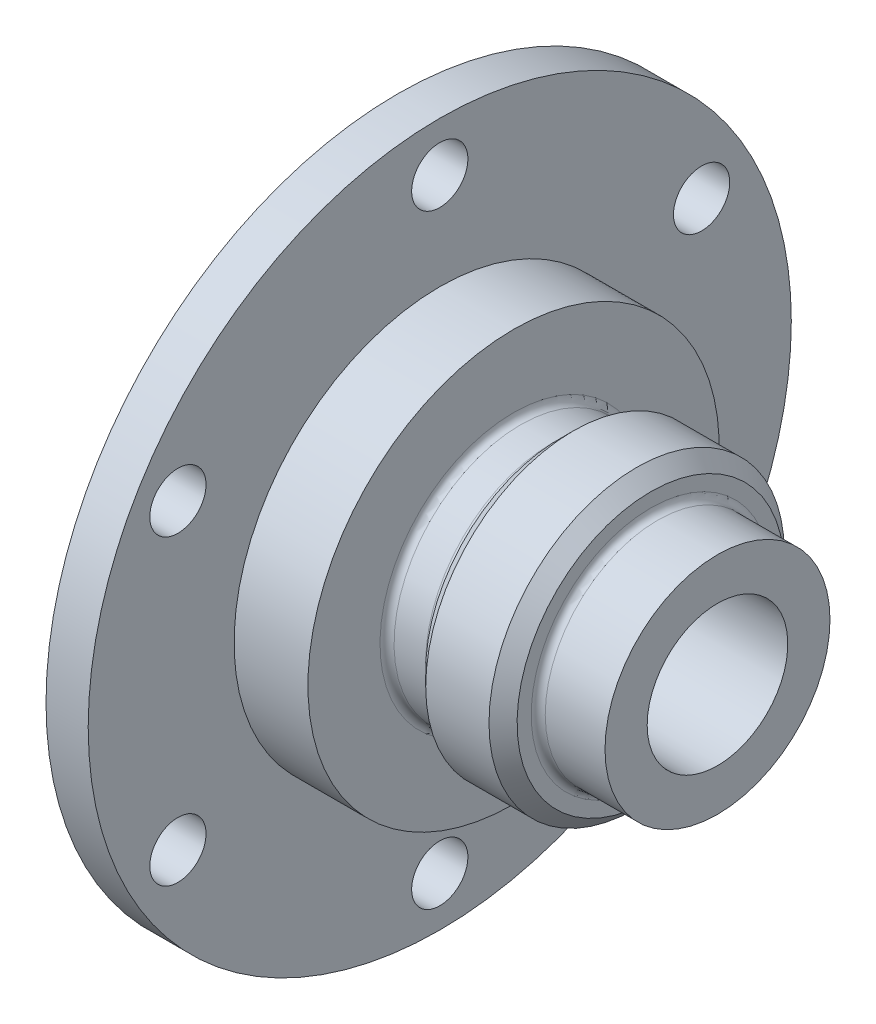
ISO-10303-21;
HEADER;
FILE_DESCRIPTION(('STEP AP214'),'2;1');
FILE_NAME('part.step','',(''),(''),'','','');
FILE_SCHEMA(('AUTOMOTIVE_DESIGN { 1 0 10303 214 1 1 1 1 }'));
ENDSEC;
DATA;
#1=APPLICATION_CONTEXT('core data for automotive mechanical design processes');
#2=APPLICATION_PROTOCOL_DEFINITION('international standard','automotive_design',2000,#1);
#3=PRODUCT_CONTEXT('',#1,'mechanical');
#4=PRODUCT('Part','Part','',(#3));
#5=PRODUCT_RELATED_PRODUCT_CATEGORY('part','',(#4));
#6=PRODUCT_DEFINITION_FORMATION('','',#4);
#7=PRODUCT_DEFINITION_CONTEXT('part definition',#1,'design');
#8=PRODUCT_DEFINITION('design','',#6,#7);
#9=PRODUCT_DEFINITION_SHAPE('','',#8);
#10=(LENGTH_UNIT() NAMED_UNIT(*) SI_UNIT(.MILLI.,.METRE.));
#11=(NAMED_UNIT(*) PLANE_ANGLE_UNIT() SI_UNIT($,.RADIAN.));
#12=(NAMED_UNIT(*) SI_UNIT($,.STERADIAN.) SOLID_ANGLE_UNIT());
#13=UNCERTAINTY_MEASURE_WITH_UNIT(LENGTH_MEASURE(1.E-05),#10,'distance_accuracy_value','');
#14=(GEOMETRIC_REPRESENTATION_CONTEXT(3) GLOBAL_UNCERTAINTY_ASSIGNED_CONTEXT((#13)) GLOBAL_UNIT_ASSIGNED_CONTEXT((#10,
#11,#12)) REPRESENTATION_CONTEXT('',''));
#15=CARTESIAN_POINT('',(0.,0.,0.));
#16=DIRECTION('',(0.,0.,1.));
#17=DIRECTION('',(1.,0.,0.));
#18=AXIS2_PLACEMENT_3D('',#15,#16,#17);
#19=CARTESIAN_POINT('',(0.,0.,0.));
#20=DIRECTION('',(-1.,0.,0.));
#21=DIRECTION('',(0.,-1.,0.));
#22=AXIS2_PLACEMENT_3D('',#19,#20,#21);
#23=PLANE('',#22);
#24=CARTESIAN_POINT('',(0.,43.,0.));
#25=DIRECTION('',(-1.,0.,0.));
#26=DIRECTION('',(0.,0.,1.));
#27=AXIS2_PLACEMENT_3D('',#24,#25,#26);
#28=CIRCLE('',#27,4.00000000000002);
#29=CARTESIAN_POINT('',(0.,43.,4.00000000000002));
#30=VERTEX_POINT('',#29);
#31=EDGE_CURVE('E83',#30,#30,#28,.T.);
#32=ORIENTED_EDGE('',*,*,#31,.F.);
#33=EDGE_LOOP('',(#32));
#34=FACE_BOUND('',#33,.T.);
#35=CARTESIAN_POINT('',(0.,21.4999999999999,37.2390923627309));
#36=DIRECTION('',(-1.,0.,0.));
#37=DIRECTION('',(0.,0.,1.));
#38=AXIS2_PLACEMENT_3D('',#35,#36,#37);
#39=CIRCLE('',#38,4.00000000000001);
#40=CARTESIAN_POINT('',(0.,21.4999999999999,41.2390923627309));
#41=VERTEX_POINT('',#40);
#42=EDGE_CURVE('E82',#41,#41,#39,.T.);
#43=ORIENTED_EDGE('',*,*,#42,.F.);
#44=EDGE_LOOP('',(#43));
#45=FACE_BOUND('',#44,.T.);
#46=CARTESIAN_POINT('',(0.,-21.5000000000002,37.2390923627308));
#47=DIRECTION('',(-1.,0.,0.));
#48=DIRECTION('',(0.,0.,1.));
#49=AXIS2_PLACEMENT_3D('',#46,#47,#48);
#50=CIRCLE('',#49,4.00000000000001);
#51=CARTESIAN_POINT('',(0.,-21.5000000000002,41.2390923627308));
#52=VERTEX_POINT('',#51);
#53=EDGE_CURVE('E88',#52,#52,#50,.T.);
#54=ORIENTED_EDGE('',*,*,#53,.F.);
#55=EDGE_LOOP('',(#54));
#56=FACE_BOUND('',#55,.T.);
#57=CARTESIAN_POINT('',(0.,-43.,-3.00267395140509E-13));
#58=DIRECTION('',(-1.,0.,0.));
#59=DIRECTION('',(0.,0.,1.));
#60=AXIS2_PLACEMENT_3D('',#57,#58,#59);
#61=CIRCLE('',#60,4.00000000000002);
#62=CARTESIAN_POINT('',(0.,-43.,3.99999999999972));
#63=VERTEX_POINT('',#62);
#64=EDGE_CURVE('E87',#63,#63,#61,.T.);
#65=ORIENTED_EDGE('',*,*,#64,.F.);
#66=EDGE_LOOP('',(#65));
#67=FACE_BOUND('',#66,.T.);
#68=CARTESIAN_POINT('',(0.,-21.4999999999997,-37.2390923627311));
#69=DIRECTION('',(-1.,0.,0.));
#70=DIRECTION('',(0.,0.,1.));
#71=AXIS2_PLACEMENT_3D('',#68,#69,#70);
#72=CIRCLE('',#71,4.00000000000001);
#73=CARTESIAN_POINT('',(0.,-21.4999999999997,-33.239092362731));
#74=VERTEX_POINT('',#73);
#75=EDGE_CURVE('E92',#74,#74,#72,.T.);
#76=ORIENTED_EDGE('',*,*,#75,.F.);
#77=EDGE_LOOP('',(#76));
#78=FACE_BOUND('',#77,.T.);
#79=CARTESIAN_POINT('',(0.,21.5000000000004,-37.2390923627306));
#80=DIRECTION('',(-1.,0.,0.));
#81=DIRECTION('',(0.,0.,1.));
#82=AXIS2_PLACEMENT_3D('',#79,#80,#81);
#83=CIRCLE('',#82,4.00000000000001);
#84=CARTESIAN_POINT('',(0.,21.5000000000004,-33.2390923627306));
#85=VERTEX_POINT('',#84);
#86=EDGE_CURVE('E96',#85,#85,#83,.T.);
#87=ORIENTED_EDGE('',*,*,#86,.F.);
#88=EDGE_LOOP('',(#87));
#89=FACE_BOUND('',#88,.T.);
#90=CARTESIAN_POINT('',(0.,0.,0.));
#91=DIRECTION('',(-1.,0.,0.));
#92=DIRECTION('',(0.,0.,1.));
#93=AXIS2_PLACEMENT_3D('',#90,#91,#92);
#94=CIRCLE('',#93,22.25);
#95=CARTESIAN_POINT('',(0.,0.,22.25));
#96=VERTEX_POINT('',#95);
#97=EDGE_CURVE('E100',#96,#96,#94,.T.);
#98=ORIENTED_EDGE('',*,*,#97,.F.);
#99=EDGE_LOOP('',(#98));
#100=FACE_BOUND('',#99,.T.);
#101=CARTESIAN_POINT('',(0.,0.,0.));
#102=DIRECTION('',(1.,0.,0.));
#103=DIRECTION('',(0.,1.,0.));
#104=AXIS2_PLACEMENT_3D('',#101,#102,#103);
#105=CIRCLE('',#104,50.);
#106=CARTESIAN_POINT('',(0.,50.,0.));
#107=VERTEX_POINT('',#106);
#108=EDGE_CURVE('E78',#107,#107,#105,.T.);
#109=ORIENTED_EDGE('',*,*,#108,.F.);
#110=EDGE_LOOP('',(#109));
#111=FACE_BOUND('',#110,.T.);
#112=ADVANCED_FACE('F43',(#34,#45,#56,#67,#78,#89,#100,#111),#23,.T.);
#113=CARTESIAN_POINT('',(45.5,0.,0.));
#114=DIRECTION('',(1.,0.,0.));
#115=DIRECTION('',(0.,1.,0.));
#116=AXIS2_PLACEMENT_3D('',#113,#114,#115);
#117=CYLINDRICAL_SURFACE('',#116,50.);
#118=ORIENTED_EDGE('',*,*,#108,.T.);
#119=EDGE_LOOP('',(#118));
#120=FACE_BOUND('',#119,.T.);
#121=CARTESIAN_POINT('',(6.,0.,0.));
#122=DIRECTION('',(1.,0.,0.));
#123=DIRECTION('',(0.,1.,0.));
#124=AXIS2_PLACEMENT_3D('',#121,#122,#123);
#125=CIRCLE('',#124,50.);
#126=CARTESIAN_POINT('',(6.,50.,0.));
#127=VERTEX_POINT('',#126);
#128=EDGE_CURVE('E103',#127,#127,#125,.T.);
#129=ORIENTED_EDGE('',*,*,#128,.F.);
#130=EDGE_LOOP('',(#129));
#131=FACE_BOUND('',#130,.T.);
#132=ADVANCED_FACE('F146',(#120,#131),#117,.T.);
#133=CARTESIAN_POINT('',(6.,50.,0.));
#134=DIRECTION('',(1.,0.,0.));
#135=DIRECTION('',(0.,1.,0.));
#136=AXIS2_PLACEMENT_3D('',#133,#134,#135);
#137=PLANE('',#136);
#138=CARTESIAN_POINT('',(6.,43.,0.));
#139=DIRECTION('',(1.,0.,0.));
#140=DIRECTION('',(0.,1.,0.));
#141=AXIS2_PLACEMENT_3D('',#138,#139,#140);
#142=CIRCLE('',#141,4.00000000000001);
#143=CARTESIAN_POINT('',(6.,47.,0.));
#144=VERTEX_POINT('',#143);
#145=EDGE_CURVE('E79',#144,#144,#142,.T.);
#146=ORIENTED_EDGE('',*,*,#145,.F.);
#147=EDGE_LOOP('',(#146));
#148=FACE_BOUND('',#147,.T.);
#149=CARTESIAN_POINT('',(6.,21.4999999999999,37.2390923627309));
#150=DIRECTION('',(1.,0.,0.));
#151=DIRECTION('',(0.,1.,0.));
#152=AXIS2_PLACEMENT_3D('',#149,#150,#151);
#153=CIRCLE('',#152,4.00000000000001);
#154=CARTESIAN_POINT('',(6.,25.4999999999999,37.2390923627309));
#155=VERTEX_POINT('',#154);
#156=EDGE_CURVE('E134',#155,#155,#153,.T.);
#157=ORIENTED_EDGE('',*,*,#156,.F.);
#158=EDGE_LOOP('',(#157));
#159=FACE_BOUND('',#158,.T.);
#160=CARTESIAN_POINT('',(6.,-21.5000000000002,37.2390923627308));
#161=DIRECTION('',(1.,0.,0.));
#162=DIRECTION('',(0.,1.,0.));
#163=AXIS2_PLACEMENT_3D('',#160,#161,#162);
#164=CIRCLE('',#163,4.00000000000001);
#165=CARTESIAN_POINT('',(6.,-17.5000000000002,37.2390923627308));
#166=VERTEX_POINT('',#165);
#167=EDGE_CURVE('E84',#166,#166,#164,.T.);
#168=ORIENTED_EDGE('',*,*,#167,.F.);
#169=EDGE_LOOP('',(#168));
#170=FACE_BOUND('',#169,.T.);
#171=CARTESIAN_POINT('',(6.,-43.,-3.00267395140509E-13));
#172=DIRECTION('',(1.,0.,0.));
#173=DIRECTION('',(0.,1.,0.));
#174=AXIS2_PLACEMENT_3D('',#171,#172,#173);
#175=CIRCLE('',#174,4.00000000000001);
#176=CARTESIAN_POINT('',(6.,-39.,-3.00267395140509E-13));
#177=VERTEX_POINT('',#176);
#178=EDGE_CURVE('E89',#177,#177,#175,.T.);
#179=ORIENTED_EDGE('',*,*,#178,.F.);
#180=EDGE_LOOP('',(#179));
#181=FACE_BOUND('',#180,.T.);
#182=CARTESIAN_POINT('',(6.,-21.4999999999997,-37.2390923627311));
#183=DIRECTION('',(1.,0.,0.));
#184=DIRECTION('',(0.,1.,0.));
#185=AXIS2_PLACEMENT_3D('',#182,#183,#184);
#186=CIRCLE('',#185,4.00000000000001);
#187=CARTESIAN_POINT('',(6.,-17.4999999999996,-37.2390923627311));
#188=VERTEX_POINT('',#187);
#189=EDGE_CURVE('E93',#188,#188,#186,.T.);
#190=ORIENTED_EDGE('',*,*,#189,.F.);
#191=EDGE_LOOP('',(#190));
#192=FACE_BOUND('',#191,.T.);
#193=CARTESIAN_POINT('',(6.,21.5000000000004,-37.2390923627306));
#194=DIRECTION('',(1.,0.,0.));
#195=DIRECTION('',(0.,1.,0.));
#196=AXIS2_PLACEMENT_3D('',#193,#194,#195);
#197=CIRCLE('',#196,4.00000000000001);
#198=CARTESIAN_POINT('',(6.,25.5000000000004,-37.2390923627306));
#199=VERTEX_POINT('',#198);
#200=EDGE_CURVE('E97',#199,#199,#197,.T.);
#201=ORIENTED_EDGE('',*,*,#200,.F.);
#202=EDGE_LOOP('',(#201));
#203=FACE_BOUND('',#202,.T.);
#204=ORIENTED_EDGE('',*,*,#128,.T.);
#205=EDGE_LOOP('',(#204));
#206=FACE_BOUND('',#205,.T.);
#207=CARTESIAN_POINT('',(6.00000000000001,0.,0.));
#208=DIRECTION('',(1.,0.,0.));
#209=DIRECTION('',(0.,1.,0.));
#210=AXIS2_PLACEMENT_3D('',#207,#208,#209);
#211=CIRCLE('',#210,29.25);
#212=CARTESIAN_POINT('',(6.00000000000001,29.25,0.));
#213=VERTEX_POINT('',#212);
#214=EDGE_CURVE('E106',#213,#213,#211,.T.);
#215=ORIENTED_EDGE('',*,*,#214,.F.);
#216=EDGE_LOOP('',(#215));
#217=FACE_BOUND('',#216,.T.);
#218=ADVANCED_FACE('F164',(#148,#159,#170,#181,#192,#203,#206,#217),#137,.T.);
#219=CARTESIAN_POINT('',(45.5,0.,0.));
#220=DIRECTION('',(1.,0.,0.));
#221=DIRECTION('',(0.,1.,0.));
#222=AXIS2_PLACEMENT_3D('',#219,#220,#221);
#223=CYLINDRICAL_SURFACE('',#222,29.25);
#224=ORIENTED_EDGE('',*,*,#214,.T.);
#225=EDGE_LOOP('',(#224));
#226=FACE_BOUND('',#225,.T.);
#227=CARTESIAN_POINT('',(16.5,0.,0.));
#228=DIRECTION('',(1.,0.,0.));
#229=DIRECTION('',(0.,1.,0.));
#230=AXIS2_PLACEMENT_3D('',#227,#228,#229);
#231=CIRCLE('',#230,29.25);
#232=CARTESIAN_POINT('',(16.5,29.25,0.));
#233=VERTEX_POINT('',#232);
#234=EDGE_CURVE('E109',#233,#233,#231,.T.);
#235=ORIENTED_EDGE('',*,*,#234,.F.);
#236=EDGE_LOOP('',(#235));
#237=FACE_BOUND('',#236,.T.);
#238=ADVANCED_FACE('F170',(#226,#237),#223,.T.);
#239=CARTESIAN_POINT('',(16.5,29.25,0.));
#240=DIRECTION('',(1.,0.,0.));
#241=DIRECTION('',(0.,1.,0.));
#242=AXIS2_PLACEMENT_3D('',#239,#240,#241);
#243=PLANE('',#242);
#244=CARTESIAN_POINT('',(16.5,0.,0.));
#245=DIRECTION('',(1.,0.,0.));
#246=DIRECTION('',(0.,1.,0.));
#247=AXIS2_PLACEMENT_3D('',#244,#245,#246);
#248=CIRCLE('',#247,19.);
#249=CARTESIAN_POINT('',(16.5,19.,0.));
#250=VERTEX_POINT('',#249);
#251=EDGE_CURVE('E10',#250,#250,#248,.F.);
#252=ORIENTED_EDGE('',*,*,#251,.T.);
#253=EDGE_LOOP('',(#252));
#254=FACE_BOUND('',#253,.T.);
#255=ORIENTED_EDGE('',*,*,#234,.T.);
#256=EDGE_LOOP('',(#255));
#257=FACE_BOUND('',#256,.T.);
#258=ADVANCED_FACE('F177',(#254,#257),#243,.T.);
#259=CARTESIAN_POINT('',(45.5,0.,0.));
#260=DIRECTION('',(1.,0.,0.));
#261=DIRECTION('',(0.,1.,0.));
#262=AXIS2_PLACEMENT_3D('',#259,#260,#261);
#263=CYLINDRICAL_SURFACE('',#262,18.);
#264=CARTESIAN_POINT('',(22.,0.,0.));
#265=DIRECTION('',(-1.,0.,0.));
#266=DIRECTION('',(0.,-1.,0.));
#267=AXIS2_PLACEMENT_3D('',#264,#265,#266);
#268=CIRCLE('',#267,18.);
#269=CARTESIAN_POINT('',(22.,-18.,0.));
#270=VERTEX_POINT('',#269);
#271=EDGE_CURVE('E50',#270,#270,#268,.T.);
#272=ORIENTED_EDGE('',*,*,#271,.T.);
#273=EDGE_LOOP('',(#272));
#274=FACE_BOUND('',#273,.T.);
#275=CARTESIAN_POINT('',(17.5,0.,0.));
#276=DIRECTION('',(1.,0.,0.));
#277=DIRECTION('',(0.,1.,0.));
#278=AXIS2_PLACEMENT_3D('',#275,#276,#277);
#279=CIRCLE('',#278,18.);
#280=CARTESIAN_POINT('',(17.5,18.,0.));
#281=VERTEX_POINT('',#280);
#282=EDGE_CURVE('E54',#281,#281,#279,.T.);
#283=ORIENTED_EDGE('',*,*,#282,.T.);
#284=EDGE_LOOP('',(#283));
#285=FACE_BOUND('',#284,.T.);
#286=ADVANCED_FACE('F182',(#274,#285),#263,.T.);
#287=CARTESIAN_POINT('',(45.5,0.,0.));
#288=DIRECTION('',(1.,0.,0.));
#289=DIRECTION('',(0.,1.,0.));
#290=AXIS2_PLACEMENT_3D('',#287,#288,#289);
#291=CYLINDRICAL_SURFACE('',#290,21.);
#292=CARTESIAN_POINT('',(34.,0.,0.));
#293=DIRECTION('',(1.,0.,0.));
#294=DIRECTION('',(0.,1.,0.));
#295=AXIS2_PLACEMENT_3D('',#292,#293,#294);
#296=CIRCLE('',#295,21.);
#297=CARTESIAN_POINT('',(34.,21.,0.));
#298=VERTEX_POINT('',#297);
#299=EDGE_CURVE('E69',#298,#298,#296,.F.);
#300=ORIENTED_EDGE('',*,*,#299,.T.);
#301=EDGE_LOOP('',(#300));
#302=FACE_BOUND('',#301,.T.);
#303=CARTESIAN_POINT('',(25.,0.,0.));
#304=DIRECTION('',(-1.,0.,0.));
#305=DIRECTION('',(0.,-1.,0.));
#306=AXIS2_PLACEMENT_3D('',#303,#304,#305);
#307=CIRCLE('',#306,21.);
#308=CARTESIAN_POINT('',(25.,-21.,0.));
#309=VERTEX_POINT('',#308);
#310=EDGE_CURVE('E72',#309,#309,#307,.F.);
#311=ORIENTED_EDGE('',*,*,#310,.T.);
#312=EDGE_LOOP('',(#311));
#313=FACE_BOUND('',#312,.T.);
#314=ADVANCED_FACE('F188',(#302,#313),#291,.T.);
#315=CARTESIAN_POINT('',(36.,21.,0.));
#316=DIRECTION('',(1.,0.,0.));
#317=DIRECTION('',(0.,1.,0.));
#318=AXIS2_PLACEMENT_3D('',#315,#316,#317);
#319=PLANE('',#318);
#320=CARTESIAN_POINT('',(36.,0.,0.));
#321=DIRECTION('',(1.,0.,0.));
#322=DIRECTION('',(0.,1.,0.));
#323=AXIS2_PLACEMENT_3D('',#320,#321,#322);
#324=CIRCLE('',#323,17.);
#325=CARTESIAN_POINT('',(36.,17.,0.));
#326=VERTEX_POINT('',#325);
#327=EDGE_CURVE('E58',#326,#326,#324,.F.);
#328=ORIENTED_EDGE('',*,*,#327,.T.);
#329=EDGE_LOOP('',(#328));
#330=FACE_BOUND('',#329,.T.);
#331=CARTESIAN_POINT('',(36.,0.,0.));
#332=DIRECTION('',(1.,0.,0.));
#333=DIRECTION('',(0.,1.,0.));
#334=AXIS2_PLACEMENT_3D('',#331,#332,#333);
#335=CIRCLE('',#334,19.);
#336=CARTESIAN_POINT('',(36.,19.,0.));
#337=VERTEX_POINT('',#336);
#338=EDGE_CURVE('E75',#337,#337,#335,.T.);
#339=ORIENTED_EDGE('',*,*,#338,.T.);
#340=EDGE_LOOP('',(#339));
#341=FACE_BOUND('',#340,.T.);
#342=ADVANCED_FACE('F222',(#330,#341),#319,.T.);
#343=CARTESIAN_POINT('',(45.5,0.,0.));
#344=DIRECTION('',(1.,0.,0.));
#345=DIRECTION('',(0.,1.,0.));
#346=AXIS2_PLACEMENT_3D('',#343,#344,#345);
#347=CYLINDRICAL_SURFACE('',#346,16.);
#348=CARTESIAN_POINT('',(37.,0.,0.));
#349=DIRECTION('',(1.,0.,0.));
#350=DIRECTION('',(0.,1.,0.));
#351=AXIS2_PLACEMENT_3D('',#348,#349,#350);
#352=CIRCLE('',#351,16.);
#353=CARTESIAN_POINT('',(37.,16.,0.));
#354=VERTEX_POINT('',#353);
#355=EDGE_CURVE('E63',#354,#354,#352,.T.);
#356=ORIENTED_EDGE('',*,*,#355,.T.);
#357=EDGE_LOOP('',(#356));
#358=FACE_BOUND('',#357,.T.);
#359=CARTESIAN_POINT('',(45.5,0.,0.));
#360=DIRECTION('',(1.,0.,0.));
#361=DIRECTION('',(0.,1.,0.));
#362=AXIS2_PLACEMENT_3D('',#359,#360,#361);
#363=CIRCLE('',#362,16.);
#364=CARTESIAN_POINT('',(45.5,16.,0.));
#365=VERTEX_POINT('',#364);
#366=EDGE_CURVE('E112',#365,#365,#363,.T.);
#367=ORIENTED_EDGE('',*,*,#366,.F.);
#368=EDGE_LOOP('',(#367));
#369=FACE_BOUND('',#368,.T.);
#370=ADVANCED_FACE('F227',(#358,#369),#347,.T.);
#371=CARTESIAN_POINT('',(45.5,16.,0.));
#372=DIRECTION('',(1.,0.,0.));
#373=DIRECTION('',(0.,1.,0.));
#374=AXIS2_PLACEMENT_3D('',#371,#372,#373);
#375=PLANE('',#374);
#376=CARTESIAN_POINT('',(45.5,0.,0.));
#377=DIRECTION('',(-1.,0.,0.));
#378=DIRECTION('',(0.,0.,1.));
#379=AXIS2_PLACEMENT_3D('',#376,#377,#378);
#380=CIRCLE('',#379,10.);
#381=CARTESIAN_POINT('',(45.5,0.,10.));
#382=VERTEX_POINT('',#381);
#383=EDGE_CURVE('E115',#382,#382,#380,.T.);
#384=ORIENTED_EDGE('',*,*,#383,.T.);
#385=EDGE_LOOP('',(#384));
#386=FACE_BOUND('',#385,.T.);
#387=ORIENTED_EDGE('',*,*,#366,.T.);
#388=EDGE_LOOP('',(#387));
#389=FACE_BOUND('',#388,.T.);
#390=ADVANCED_FACE('F233',(#386,#389),#375,.T.);
#391=CARTESIAN_POINT('',(0.,0.,0.));
#392=DIRECTION('',(-1.,0.,0.));
#393=DIRECTION('',(0.,0.,1.));
#394=AXIS2_PLACEMENT_3D('',#391,#392,#393);
#395=CYLINDRICAL_SURFACE('',#394,10.);
#396=ORIENTED_EDGE('',*,*,#383,.F.);
#397=EDGE_LOOP('',(#396));
#398=FACE_BOUND('',#397,.T.);
#399=CARTESIAN_POINT('',(9.50000000000001,0.,0.));
#400=DIRECTION('',(-1.,0.,0.));
#401=DIRECTION('',(0.,0.,1.));
#402=AXIS2_PLACEMENT_3D('',#399,#400,#401);
#403=CIRCLE('',#402,10.);
#404=CARTESIAN_POINT('',(9.50000000000001,0.,10.));
#405=VERTEX_POINT('',#404);
#406=EDGE_CURVE('E118',#405,#405,#403,.T.);
#407=ORIENTED_EDGE('',*,*,#406,.T.);
#408=EDGE_LOOP('',(#407));
#409=FACE_BOUND('',#408,.T.);
#410=ADVANCED_FACE('F237',(#398,#409),#395,.F.);
#411=CARTESIAN_POINT('',(9.50000000000001,0.,0.));
#412=DIRECTION('',(-1.,0.,0.));
#413=DIRECTION('',(0.,0.,1.));
#414=AXIS2_PLACEMENT_3D('',#411,#412,#413);
#415=PLANE('',#414);
#416=CARTESIAN_POINT('',(9.50000000000001,0.,0.));
#417=DIRECTION('',(-1.,0.,0.));
#418=DIRECTION('',(0.,0.,1.));
#419=AXIS2_PLACEMENT_3D('',#416,#417,#418);
#420=CIRCLE('',#419,22.25);
#421=CARTESIAN_POINT('',(9.50000000000001,0.,22.25));
#422=VERTEX_POINT('',#421);
#423=EDGE_CURVE('E121',#422,#422,#420,.T.);
#424=ORIENTED_EDGE('',*,*,#423,.T.);
#425=EDGE_LOOP('',(#424));
#426=FACE_BOUND('',#425,.T.);
#427=ORIENTED_EDGE('',*,*,#406,.F.);
#428=EDGE_LOOP('',(#427));
#429=FACE_BOUND('',#428,.T.);
#430=ADVANCED_FACE('F241',(#426,#429),#415,.T.);
#431=CARTESIAN_POINT('',(0.,0.,0.));
#432=DIRECTION('',(-1.,0.,0.));
#433=DIRECTION('',(0.,0.,1.));
#434=AXIS2_PLACEMENT_3D('',#431,#432,#433);
#435=CYLINDRICAL_SURFACE('',#434,22.25);
#436=ORIENTED_EDGE('',*,*,#423,.F.);
#437=EDGE_LOOP('',(#436));
#438=FACE_BOUND('',#437,.T.);
#439=ORIENTED_EDGE('',*,*,#97,.T.);
#440=EDGE_LOOP('',(#439));
#441=FACE_BOUND('',#440,.T.);
#442=ADVANCED_FACE('F245',(#438,#441),#435,.F.);
#443=CARTESIAN_POINT('',(0.,21.5000000000004,-37.2390923627306));
#444=DIRECTION('',(-1.,0.,0.));
#445=DIRECTION('',(0.,0.,1.));
#446=AXIS2_PLACEMENT_3D('',#443,#444,#445);
#447=CYLINDRICAL_SURFACE('',#446,4.00000000000001);
#448=ORIENTED_EDGE('',*,*,#200,.T.);
#449=EDGE_LOOP('',(#448));
#450=FACE_BOUND('',#449,.T.);
#451=ORIENTED_EDGE('',*,*,#86,.T.);
#452=EDGE_LOOP('',(#451));
#453=FACE_BOUND('',#452,.T.);
#454=ADVANCED_FACE('F249',(#450,#453),#447,.F.);
#455=CARTESIAN_POINT('',(0.,-21.4999999999997,-37.2390923627311));
#456=DIRECTION('',(-1.,0.,0.));
#457=DIRECTION('',(0.,0.,1.));
#458=AXIS2_PLACEMENT_3D('',#455,#456,#457);
#459=CYLINDRICAL_SURFACE('',#458,4.00000000000001);
#460=ORIENTED_EDGE('',*,*,#189,.T.);
#461=EDGE_LOOP('',(#460));
#462=FACE_BOUND('',#461,.T.);
#463=ORIENTED_EDGE('',*,*,#75,.T.);
#464=EDGE_LOOP('',(#463));
#465=FACE_BOUND('',#464,.T.);
#466=ADVANCED_FACE('F253',(#462,#465),#459,.F.);
#467=CARTESIAN_POINT('',(0.,-43.,-3.00267395140509E-13));
#468=DIRECTION('',(-1.,0.,0.));
#469=DIRECTION('',(0.,0.,1.));
#470=AXIS2_PLACEMENT_3D('',#467,#468,#469);
#471=CYLINDRICAL_SURFACE('',#470,4.00000000000001);
#472=ORIENTED_EDGE('',*,*,#178,.T.);
#473=EDGE_LOOP('',(#472));
#474=FACE_BOUND('',#473,.T.);
#475=ORIENTED_EDGE('',*,*,#64,.T.);
#476=EDGE_LOOP('',(#475));
#477=FACE_BOUND('',#476,.T.);
#478=ADVANCED_FACE('F257',(#474,#477),#471,.F.);
#479=CARTESIAN_POINT('',(0.,-21.5000000000002,37.2390923627308));
#480=DIRECTION('',(-1.,0.,0.));
#481=DIRECTION('',(0.,0.,1.));
#482=AXIS2_PLACEMENT_3D('',#479,#480,#481);
#483=CYLINDRICAL_SURFACE('',#482,4.00000000000001);
#484=ORIENTED_EDGE('',*,*,#167,.T.);
#485=EDGE_LOOP('',(#484));
#486=FACE_BOUND('',#485,.T.);
#487=ORIENTED_EDGE('',*,*,#53,.T.);
#488=EDGE_LOOP('',(#487));
#489=FACE_BOUND('',#488,.T.);
#490=ADVANCED_FACE('F261',(#486,#489),#483,.F.);
#491=CARTESIAN_POINT('',(0.,21.4999999999999,37.2390923627309));
#492=DIRECTION('',(-1.,0.,0.));
#493=DIRECTION('',(0.,0.,1.));
#494=AXIS2_PLACEMENT_3D('',#491,#492,#493);
#495=CYLINDRICAL_SURFACE('',#494,4.00000000000001);
#496=ORIENTED_EDGE('',*,*,#156,.T.);
#497=EDGE_LOOP('',(#496));
#498=FACE_BOUND('',#497,.T.);
#499=ORIENTED_EDGE('',*,*,#42,.T.);
#500=EDGE_LOOP('',(#499));
#501=FACE_BOUND('',#500,.T.);
#502=ADVANCED_FACE('F265',(#498,#501),#495,.F.);
#503=CARTESIAN_POINT('',(0.,43.,0.));
#504=DIRECTION('',(-1.,0.,0.));
#505=DIRECTION('',(0.,0.,1.));
#506=AXIS2_PLACEMENT_3D('',#503,#504,#505);
#507=CYLINDRICAL_SURFACE('',#506,4.00000000000001);
#508=ORIENTED_EDGE('',*,*,#145,.T.);
#509=EDGE_LOOP('',(#508));
#510=FACE_BOUND('',#509,.T.);
#511=ORIENTED_EDGE('',*,*,#31,.T.);
#512=EDGE_LOOP('',(#511));
#513=FACE_BOUND('',#512,.T.);
#514=ADVANCED_FACE('F142',(#510,#513),#507,.F.);
#515=CARTESIAN_POINT('',(36.,0.,0.));
#516=DIRECTION('',(-1.,0.,0.));
#517=DIRECTION('',(0.,-1.,0.));
#518=AXIS2_PLACEMENT_3D('',#515,#516,#517);
#519=CONICAL_SURFACE('',#518,19.,0.785398163397448);
#520=ORIENTED_EDGE('',*,*,#299,.F.);
#521=EDGE_LOOP('',(#520));
#522=FACE_BOUND('',#521,.T.);
#523=ORIENTED_EDGE('',*,*,#338,.F.);
#524=EDGE_LOOP('',(#523));
#525=FACE_BOUND('',#524,.T.);
#526=ADVANCED_FACE('F193',(#522,#525),#519,.T.);
#527=CARTESIAN_POINT('',(25.,0.,0.));
#528=DIRECTION('',(1.,0.,0.));
#529=DIRECTION('',(0.,1.,0.));
#530=AXIS2_PLACEMENT_3D('',#527,#528,#529);
#531=CONICAL_SURFACE('',#530,21.,0.785398163397453);
#532=CARTESIAN_POINT('',(23.,0.,0.));
#533=DIRECTION('',(-1.,0.,0.));
#534=DIRECTION('',(0.,-1.,0.));
#535=AXIS2_PLACEMENT_3D('',#532,#533,#534);
#536=CIRCLE('',#535,19.);
#537=CARTESIAN_POINT('',(23.,-19.,0.));
#538=VERTEX_POINT('',#537);
#539=EDGE_CURVE('E66',#538,#538,#536,.T.);
#540=ORIENTED_EDGE('',*,*,#539,.F.);
#541=EDGE_LOOP('',(#540));
#542=FACE_BOUND('',#541,.T.);
#543=ORIENTED_EDGE('',*,*,#310,.F.);
#544=EDGE_LOOP('',(#543));
#545=FACE_BOUND('',#544,.T.);
#546=ADVANCED_FACE('F199',(#542,#545),#531,.T.);
#547=CARTESIAN_POINT('',(37.,0.,0.));
#548=DIRECTION('',(1.,0.,0.));
#549=DIRECTION('',(0.,1.,0.));
#550=AXIS2_PLACEMENT_3D('',#547,#548,#549);
#551=TOROIDAL_SURFACE('',#550,17.,1.);
#552=ORIENTED_EDGE('',*,*,#327,.F.);
#553=EDGE_LOOP('',(#552));
#554=FACE_BOUND('',#553,.T.);
#555=ORIENTED_EDGE('',*,*,#355,.F.);
#556=EDGE_LOOP('',(#555));
#557=FACE_BOUND('',#556,.T.);
#558=ADVANCED_FACE('F205',(#554,#557),#551,.F.);
#559=CARTESIAN_POINT('',(22.,0.,0.));
#560=DIRECTION('',(-1.,0.,0.));
#561=DIRECTION('',(0.,-1.,0.));
#562=AXIS2_PLACEMENT_3D('',#559,#560,#561);
#563=TOROIDAL_SURFACE('',#562,19.,1.);
#564=ORIENTED_EDGE('',*,*,#271,.F.);
#565=EDGE_LOOP('',(#564));
#566=FACE_BOUND('',#565,.T.);
#567=ORIENTED_EDGE('',*,*,#539,.T.);
#568=EDGE_LOOP('',(#567));
#569=FACE_BOUND('',#568,.T.);
#570=ADVANCED_FACE('F208',(#566,#569),#563,.F.);
#571=CARTESIAN_POINT('',(17.5,0.,0.));
#572=DIRECTION('',(1.,0.,0.));
#573=DIRECTION('',(0.,1.,0.));
#574=AXIS2_PLACEMENT_3D('',#571,#572,#573);
#575=TOROIDAL_SURFACE('',#574,19.,1.);
#576=ORIENTED_EDGE('',*,*,#251,.F.);
#577=EDGE_LOOP('',(#576));
#578=FACE_BOUND('',#577,.T.);
#579=ORIENTED_EDGE('',*,*,#282,.F.);
#580=EDGE_LOOP('',(#579));
#581=FACE_BOUND('',#580,.T.);
#582=ADVANCED_FACE('F45',(#578,#581),#575,.F.);
#583=CLOSED_SHELL('',(#112,#132,#218,#238,#258,#286,#314,#342,#370,#390,#410,#430,#442,#454,
#466,#478,#490,#502,#514,#526,#546,#558,#570,#582));
#584=MANIFOLD_SOLID_BREP('B2',#583);
#585=ADVANCED_BREP_SHAPE_REPRESENTATION('',(#18,#584),#14);
#586=SHAPE_DEFINITION_REPRESENTATION(#9,#585);
ENDSEC;
END-ISO-10303-21;
